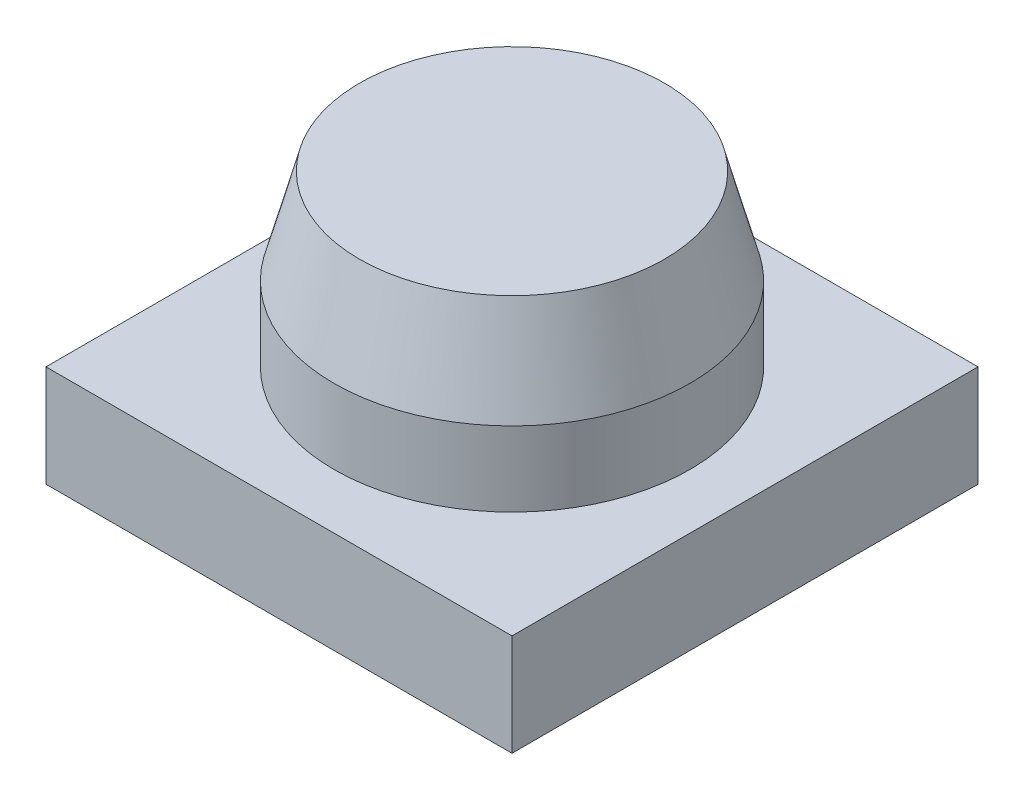
ISO-10303-21;
HEADER;
FILE_DESCRIPTION(('STEP AP214'),'2;1');
FILE_NAME('part.step','',(''),(''),'','','');
FILE_SCHEMA(('AUTOMOTIVE_DESIGN { 1 0 10303 214 1 1 1 1 }'));
ENDSEC;
DATA;
#1=APPLICATION_CONTEXT('core data for automotive mechanical design processes');
#2=APPLICATION_PROTOCOL_DEFINITION('international standard','automotive_design',2000,#1);
#3=PRODUCT_CONTEXT('',#1,'mechanical');
#4=PRODUCT('Part','Part','',(#3));
#5=PRODUCT_RELATED_PRODUCT_CATEGORY('part','',(#4));
#6=PRODUCT_DEFINITION_FORMATION('','',#4);
#7=PRODUCT_DEFINITION_CONTEXT('part definition',#1,'design');
#8=PRODUCT_DEFINITION('design','',#6,#7);
#9=PRODUCT_DEFINITION_SHAPE('','',#8);
#10=(LENGTH_UNIT() NAMED_UNIT(*) SI_UNIT(.MILLI.,.METRE.));
#11=(NAMED_UNIT(*) PLANE_ANGLE_UNIT() SI_UNIT($,.RADIAN.));
#12=(NAMED_UNIT(*) SI_UNIT($,.STERADIAN.) SOLID_ANGLE_UNIT());
#13=UNCERTAINTY_MEASURE_WITH_UNIT(LENGTH_MEASURE(1.E-05),#10,'distance_accuracy_value','');
#14=(GEOMETRIC_REPRESENTATION_CONTEXT(3) GLOBAL_UNCERTAINTY_ASSIGNED_CONTEXT((#13)) GLOBAL_UNIT_ASSIGNED_CONTEXT((#10,
#11,#12)) REPRESENTATION_CONTEXT('',''));
#15=CARTESIAN_POINT('',(0.,0.,0.));
#16=DIRECTION('',(0.,0.,1.));
#17=DIRECTION('',(1.,0.,0.));
#18=AXIS2_PLACEMENT_3D('',#15,#16,#17);
#19=CARTESIAN_POINT('',(2.75,1.2,2.75));
#20=DIRECTION('',(-1.,0.,0.));
#21=DIRECTION('',(0.,0.,1.));
#22=AXIS2_PLACEMENT_3D('',#19,#20,#21);
#23=PLANE('',#22);
#24=DIRECTION('',(0.,0.,-1.));
#25=VECTOR('',#24,1.);
#26=CARTESIAN_POINT('',(2.75,0.,2.75));
#27=LINE('',#26,#25);
#28=CARTESIAN_POINT('',(2.75,0.,2.75));
#29=VERTEX_POINT('',#28);
#30=CARTESIAN_POINT('',(2.75,0.,-2.75));
#31=VERTEX_POINT('',#30);
#32=EDGE_CURVE('E100',#29,#31,#27,.T.);
#33=ORIENTED_EDGE('',*,*,#32,.T.);
#34=DIRECTION('',(0.,-1.,0.));
#35=VECTOR('',#34,1.);
#36=CARTESIAN_POINT('',(2.75,1.2,-2.75));
#37=LINE('',#36,#35);
#38=CARTESIAN_POINT('',(2.75,1.2,-2.75));
#39=VERTEX_POINT('',#38);
#40=EDGE_CURVE('E91',#39,#31,#37,.T.);
#41=ORIENTED_EDGE('',*,*,#40,.F.);
#42=DIRECTION('',(0.,0.,-1.));
#43=VECTOR('',#42,1.);
#44=CARTESIAN_POINT('',(2.75,1.2,2.75));
#45=LINE('',#44,#43);
#46=CARTESIAN_POINT('',(2.75,1.2,2.75));
#47=VERTEX_POINT('',#46);
#48=EDGE_CURVE('E85',#47,#39,#45,.T.);
#49=ORIENTED_EDGE('',*,*,#48,.F.);
#50=DIRECTION('',(0.,-1.,0.));
#51=VECTOR('',#50,1.);
#52=CARTESIAN_POINT('',(2.75,1.2,2.75));
#53=LINE('',#52,#51);
#54=EDGE_CURVE('E96',#47,#29,#53,.T.);
#55=ORIENTED_EDGE('',*,*,#54,.T.);
#56=EDGE_LOOP('',(#33,#41,#49,#55));
#57=FACE_BOUND('',#56,.T.);
#58=ADVANCED_FACE('F32',(#57),#23,.F.);
#59=CARTESIAN_POINT('',(-2.75,1.2,-2.75));
#60=DIRECTION('',(0.,0.,1.));
#61=DIRECTION('',(1.,0.,0.));
#62=AXIS2_PLACEMENT_3D('',#59,#60,#61);
#63=PLANE('',#62);
#64=DIRECTION('',(-1.,0.,0.));
#65=VECTOR('',#64,1.);
#66=CARTESIAN_POINT('',(-2.75,0.,-2.75));
#67=LINE('',#66,#65);
#68=CARTESIAN_POINT('',(-2.75,0.,-2.75));
#69=VERTEX_POINT('',#68);
#70=EDGE_CURVE('E90',#31,#69,#67,.T.);
#71=ORIENTED_EDGE('',*,*,#70,.T.);
#72=DIRECTION('',(0.,-1.,0.));
#73=VECTOR('',#72,1.);
#74=CARTESIAN_POINT('',(-2.75,1.2,-2.75));
#75=LINE('',#74,#73);
#76=CARTESIAN_POINT('',(-2.75,1.2,-2.75));
#77=VERTEX_POINT('',#76);
#78=EDGE_CURVE('E88',#77,#69,#75,.T.);
#79=ORIENTED_EDGE('',*,*,#78,.F.);
#80=DIRECTION('',(-1.,0.,0.));
#81=VECTOR('',#80,1.);
#82=CARTESIAN_POINT('',(-2.75,1.2,-2.75));
#83=LINE('',#82,#81);
#84=EDGE_CURVE('E80',#39,#77,#83,.T.);
#85=ORIENTED_EDGE('',*,*,#84,.F.);
#86=ORIENTED_EDGE('',*,*,#40,.T.);
#87=EDGE_LOOP('',(#71,#79,#85,#86));
#88=FACE_BOUND('',#87,.T.);
#89=ADVANCED_FACE('F89',(#88),#63,.F.);
#90=CARTESIAN_POINT('',(-2.75,1.2,2.75));
#91=DIRECTION('',(1.,0.,0.));
#92=DIRECTION('',(0.,0.,-1.));
#93=AXIS2_PLACEMENT_3D('',#90,#91,#92);
#94=PLANE('',#93);
#95=DIRECTION('',(0.,0.,1.));
#96=VECTOR('',#95,1.);
#97=CARTESIAN_POINT('',(-2.75,0.,2.75));
#98=LINE('',#97,#96);
#99=CARTESIAN_POINT('',(-2.75,0.,2.75));
#100=VERTEX_POINT('',#99);
#101=EDGE_CURVE('E66',#69,#100,#98,.T.);
#102=ORIENTED_EDGE('',*,*,#101,.T.);
#103=DIRECTION('',(0.,-1.,0.));
#104=VECTOR('',#103,1.);
#105=CARTESIAN_POINT('',(-2.75,1.2,2.75));
#106=LINE('',#105,#104);
#107=CARTESIAN_POINT('',(-2.75,1.2,2.75));
#108=VERTEX_POINT('',#107);
#109=EDGE_CURVE('E92',#108,#100,#106,.T.);
#110=ORIENTED_EDGE('',*,*,#109,.F.);
#111=DIRECTION('',(0.,0.,1.));
#112=VECTOR('',#111,1.);
#113=CARTESIAN_POINT('',(-2.75,1.2,2.75));
#114=LINE('',#113,#112);
#115=EDGE_CURVE('E83',#77,#108,#114,.T.);
#116=ORIENTED_EDGE('',*,*,#115,.F.);
#117=ORIENTED_EDGE('',*,*,#78,.T.);
#118=EDGE_LOOP('',(#102,#110,#116,#117));
#119=FACE_BOUND('',#118,.T.);
#120=ADVANCED_FACE('F94',(#119),#94,.F.);
#121=CARTESIAN_POINT('',(-2.75,1.2,2.75));
#122=DIRECTION('',(0.,0.,-1.));
#123=DIRECTION('',(-1.,0.,0.));
#124=AXIS2_PLACEMENT_3D('',#121,#122,#123);
#125=PLANE('',#124);
#126=DIRECTION('',(1.,0.,0.));
#127=VECTOR('',#126,1.);
#128=CARTESIAN_POINT('',(-2.75,0.,2.75));
#129=LINE('',#128,#127);
#130=EDGE_CURVE('E72',#100,#29,#129,.T.);
#131=ORIENTED_EDGE('',*,*,#130,.T.);
#132=ORIENTED_EDGE('',*,*,#54,.F.);
#133=DIRECTION('',(1.,0.,0.));
#134=VECTOR('',#133,1.);
#135=CARTESIAN_POINT('',(-2.75,1.2,2.75));
#136=LINE('',#135,#134);
#137=EDGE_CURVE('E49',#108,#47,#136,.T.);
#138=ORIENTED_EDGE('',*,*,#137,.F.);
#139=ORIENTED_EDGE('',*,*,#109,.T.);
#140=EDGE_LOOP('',(#131,#132,#138,#139));
#141=FACE_BOUND('',#140,.T.);
#142=ADVANCED_FACE('F140',(#141),#125,.F.);
#143=CARTESIAN_POINT('',(0.,1.2,0.));
#144=DIRECTION('',(0.,-1.,0.));
#145=DIRECTION('',(0.,0.,-1.));
#146=AXIS2_PLACEMENT_3D('',#143,#144,#145);
#147=PLANE('',#146);
#148=CARTESIAN_POINT('',(0.,1.2,0.));
#149=DIRECTION('',(0.,1.,0.));
#150=DIRECTION('',(0.,0.,1.));
#151=AXIS2_PLACEMENT_3D('',#148,#149,#150);
#152=CIRCLE('',#151,2.1);
#153=CARTESIAN_POINT('',(0.,1.2,2.1));
#154=VERTEX_POINT('',#153);
#155=EDGE_CURVE('E109',#154,#154,#152,.T.);
#156=ORIENTED_EDGE('',*,*,#155,.F.);
#157=EDGE_LOOP('',(#156));
#158=FACE_BOUND('',#157,.T.);
#159=ORIENTED_EDGE('',*,*,#48,.T.);
#160=ORIENTED_EDGE('',*,*,#84,.T.);
#161=ORIENTED_EDGE('',*,*,#115,.T.);
#162=ORIENTED_EDGE('',*,*,#137,.T.);
#163=EDGE_LOOP('',(#159,#160,#161,#162));
#164=FACE_BOUND('',#163,.T.);
#165=ADVANCED_FACE('F81',(#158,#164),#147,.F.);
#166=CARTESIAN_POINT('',(0.,0.,0.));
#167=DIRECTION('',(0.,-1.,0.));
#168=DIRECTION('',(0.,0.,-1.));
#169=AXIS2_PLACEMENT_3D('',#166,#167,#168);
#170=PLANE('',#169);
#171=CARTESIAN_POINT('',(0.,0.,0.));
#172=DIRECTION('',(0.,-1.,0.));
#173=DIRECTION('',(0.,0.,-1.));
#174=AXIS2_PLACEMENT_3D('',#171,#172,#173);
#175=CIRCLE('',#174,1.95);
#176=CARTESIAN_POINT('',(0.,0.,-1.95));
#177=VERTEX_POINT('',#176);
#178=EDGE_CURVE('E118',#177,#177,#175,.T.);
#179=ORIENTED_EDGE('',*,*,#178,.F.);
#180=EDGE_LOOP('',(#179));
#181=FACE_BOUND('',#180,.T.);
#182=ORIENTED_EDGE('',*,*,#32,.F.);
#183=ORIENTED_EDGE('',*,*,#130,.F.);
#184=ORIENTED_EDGE('',*,*,#101,.F.);
#185=ORIENTED_EDGE('',*,*,#70,.F.);
#186=EDGE_LOOP('',(#182,#183,#184,#185));
#187=FACE_BOUND('',#186,.T.);
#188=ADVANCED_FACE('F133',(#181,#187),#170,.T.);
#189=CARTESIAN_POINT('',(0.,3.2,0.));
#190=DIRECTION('',(0.,-1.,0.));
#191=DIRECTION('',(0.,0.,-1.));
#192=AXIS2_PLACEMENT_3D('',#189,#190,#191);
#193=CYLINDRICAL_SURFACE('',#192,2.1);
#194=CARTESIAN_POINT('',(0.,2.08038475772933,0.));
#195=DIRECTION('',(0.,1.,0.));
#196=DIRECTION('',(0.,0.,1.));
#197=AXIS2_PLACEMENT_3D('',#194,#195,#196);
#198=CIRCLE('',#197,2.1);
#199=CARTESIAN_POINT('',(0.,2.08038475772933,2.1));
#200=VERTEX_POINT('',#199);
#201=EDGE_CURVE('E11',#200,#200,#198,.F.);
#202=ORIENTED_EDGE('',*,*,#201,.T.);
#203=EDGE_LOOP('',(#202));
#204=FACE_BOUND('',#203,.T.);
#205=ORIENTED_EDGE('',*,*,#155,.T.);
#206=EDGE_LOOP('',(#205));
#207=FACE_BOUND('',#206,.T.);
#208=ADVANCED_FACE('F136',(#204,#207),#193,.T.);
#209=CARTESIAN_POINT('',(0.,3.2,0.));
#210=DIRECTION('',(0.,1.,0.));
#211=DIRECTION('',(0.,0.,1.));
#212=AXIS2_PLACEMENT_3D('',#209,#210,#211);
#213=PLANE('',#212);
#214=CARTESIAN_POINT('',(0.,3.2,0.));
#215=DIRECTION('',(0.,1.,0.));
#216=DIRECTION('',(0.,0.,1.));
#217=AXIS2_PLACEMENT_3D('',#214,#215,#216);
#218=CIRCLE('',#217,1.8);
#219=CARTESIAN_POINT('',(0.,3.2,1.8));
#220=VERTEX_POINT('',#219);
#221=EDGE_CURVE('E41',#220,#220,#218,.T.);
#222=ORIENTED_EDGE('',*,*,#221,.T.);
#223=EDGE_LOOP('',(#222));
#224=FACE_BOUND('',#223,.T.);
#225=ADVANCED_FACE('F129',(#224),#213,.T.);
#226=CARTESIAN_POINT('',(0.,0.9,0.));
#227=DIRECTION('',(0.,-1.,0.));
#228=DIRECTION('',(0.,0.,-1.));
#229=AXIS2_PLACEMENT_3D('',#226,#227,#228);
#230=CYLINDRICAL_SURFACE('',#229,1.95);
#231=CARTESIAN_POINT('',(0.,0.9,0.));
#232=DIRECTION('',(0.,-1.,0.));
#233=DIRECTION('',(0.,0.,-1.));
#234=AXIS2_PLACEMENT_3D('',#231,#232,#233);
#235=CIRCLE('',#234,1.95);
#236=CARTESIAN_POINT('',(0.,0.9,-1.95));
#237=VERTEX_POINT('',#236);
#238=EDGE_CURVE('E103',#237,#237,#235,.T.);
#239=ORIENTED_EDGE('',*,*,#238,.F.);
#240=EDGE_LOOP('',(#239));
#241=FACE_BOUND('',#240,.T.);
#242=ORIENTED_EDGE('',*,*,#178,.T.);
#243=EDGE_LOOP('',(#242));
#244=FACE_BOUND('',#243,.T.);
#245=ADVANCED_FACE('F126',(#241,#244),#230,.F.);
#246=CARTESIAN_POINT('',(0.,0.9,0.));
#247=DIRECTION('',(0.,-1.,0.));
#248=DIRECTION('',(0.,0.,-1.));
#249=AXIS2_PLACEMENT_3D('',#246,#247,#248);
#250=PLANE('',#249);
#251=ORIENTED_EDGE('',*,*,#238,.T.);
#252=EDGE_LOOP('',(#251));
#253=FACE_BOUND('',#252,.T.);
#254=ADVANCED_FACE('F124',(#253),#250,.T.);
#255=CARTESIAN_POINT('',(0.,3.2,0.));
#256=DIRECTION('',(0.,-1.,0.));
#257=DIRECTION('',(0.,0.,-1.));
#258=AXIS2_PLACEMENT_3D('',#255,#256,#257);
#259=CONICAL_SURFACE('',#258,1.8,0.26179938779915);
#260=ORIENTED_EDGE('',*,*,#201,.F.);
#261=EDGE_LOOP('',(#260));
#262=FACE_BOUND('',#261,.T.);
#263=ORIENTED_EDGE('',*,*,#221,.F.);
#264=EDGE_LOOP('',(#263));
#265=FACE_BOUND('',#264,.T.);
#266=ADVANCED_FACE('F34',(#262,#265),#259,.T.);
#267=CLOSED_SHELL('',(#58,#89,#120,#142,#165,#188,#208,#225,#245,#254,#266));
#268=MANIFOLD_SOLID_BREP('B2',#267);
#269=ADVANCED_BREP_SHAPE_REPRESENTATION('',(#18,#268),#14);
#270=SHAPE_DEFINITION_REPRESENTATION(#9,#269);
ENDSEC;
END-ISO-10303-21;
